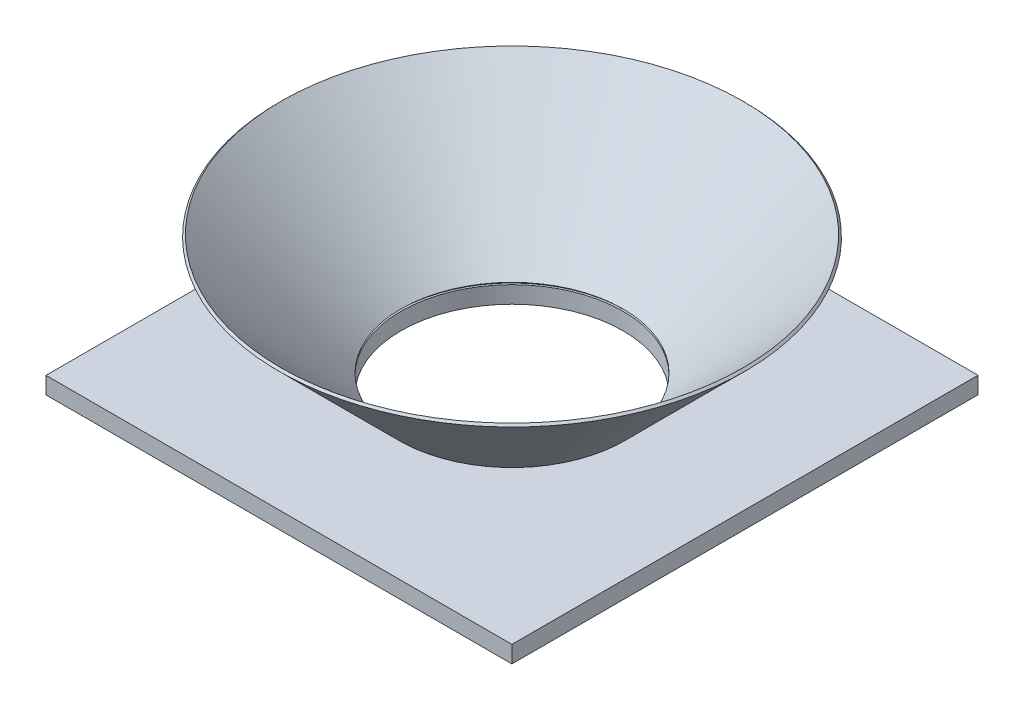
ISO-10303-21;
HEADER;
FILE_DESCRIPTION(('STEP AP214'),'2;1');
FILE_NAME('part.step','',(''),(''),'','','');
FILE_SCHEMA(('AUTOMOTIVE_DESIGN { 1 0 10303 214 1 1 1 1 }'));
ENDSEC;
DATA;
#1=APPLICATION_CONTEXT('core data for automotive mechanical design processes');
#2=APPLICATION_PROTOCOL_DEFINITION('international standard','automotive_design',2000,#1);
#3=PRODUCT_CONTEXT('',#1,'mechanical');
#4=PRODUCT('Part','Part','',(#3));
#5=PRODUCT_RELATED_PRODUCT_CATEGORY('part','',(#4));
#6=PRODUCT_DEFINITION_FORMATION('','',#4);
#7=PRODUCT_DEFINITION_CONTEXT('part definition',#1,'design');
#8=PRODUCT_DEFINITION('design','',#6,#7);
#9=PRODUCT_DEFINITION_SHAPE('','',#8);
#10=(LENGTH_UNIT() NAMED_UNIT(*) SI_UNIT(.MILLI.,.METRE.));
#11=(NAMED_UNIT(*) PLANE_ANGLE_UNIT() SI_UNIT($,.RADIAN.));
#12=(NAMED_UNIT(*) SI_UNIT($,.STERADIAN.) SOLID_ANGLE_UNIT());
#13=UNCERTAINTY_MEASURE_WITH_UNIT(LENGTH_MEASURE(1.E-05),#10,'distance_accuracy_value','');
#14=(GEOMETRIC_REPRESENTATION_CONTEXT(3) GLOBAL_UNCERTAINTY_ASSIGNED_CONTEXT((#13)) GLOBAL_UNIT_ASSIGNED_CONTEXT((#10,
#11,#12)) REPRESENTATION_CONTEXT('',''));
#15=CARTESIAN_POINT('',(0.,0.,0.));
#16=DIRECTION('',(0.,0.,1.));
#17=DIRECTION('',(1.,0.,0.));
#18=AXIS2_PLACEMENT_3D('',#15,#16,#17);
#19=CARTESIAN_POINT('',(-41.2132034355964,-3.,41.2288046063781));
#20=DIRECTION('',(-1.,0.,0.));
#21=DIRECTION('',(0.,0.,1.));
#22=AXIS2_PLACEMENT_3D('',#19,#20,#21);
#23=PLANE('',#22);
#24=DIRECTION('',(0.,0.,1.));
#25=VECTOR('',#24,1.);
#26=CARTESIAN_POINT('',(-41.2132034355964,0.,41.2288046063781));
#27=LINE('',#26,#25);
#28=CARTESIAN_POINT('',(-41.2132034355964,0.,-41.2288046063781));
#29=VERTEX_POINT('',#28);
#30=CARTESIAN_POINT('',(-41.2132034355964,0.,41.2288046063781));
#31=VERTEX_POINT('',#30);
#32=EDGE_CURVE('E106',#29,#31,#27,.T.);
#33=ORIENTED_EDGE('',*,*,#32,.F.);
#34=DIRECTION('',(0.,1.,0.));
#35=VECTOR('',#34,1.);
#36=CARTESIAN_POINT('',(-41.2132034355964,-3.,-41.2288046063781));
#37=LINE('',#36,#35);
#38=CARTESIAN_POINT('',(-41.2132034355964,-3.,-41.2288046063781));
#39=VERTEX_POINT('',#38);
#40=EDGE_CURVE('E12',#39,#29,#37,.T.);
#41=ORIENTED_EDGE('',*,*,#40,.F.);
#42=DIRECTION('',(0.,0.,1.));
#43=VECTOR('',#42,1.);
#44=CARTESIAN_POINT('',(-41.2132034355964,-3.,41.2288046063781));
#45=LINE('',#44,#43);
#46=CARTESIAN_POINT('',(-41.2132034355964,-3.,41.2288046063781));
#47=VERTEX_POINT('',#46);
#48=EDGE_CURVE('E99',#39,#47,#45,.T.);
#49=ORIENTED_EDGE('',*,*,#48,.T.);
#50=DIRECTION('',(0.,1.,0.));
#51=VECTOR('',#50,1.);
#52=CARTESIAN_POINT('',(-41.2132034355964,-3.,41.2288046063781));
#53=LINE('',#52,#51);
#54=EDGE_CURVE('E44',#47,#31,#53,.T.);
#55=ORIENTED_EDGE('',*,*,#54,.T.);
#56=EDGE_LOOP('',(#33,#41,#49,#55));
#57=FACE_BOUND('',#56,.T.);
#58=ADVANCED_FACE('F41',(#57),#23,.T.);
#59=CARTESIAN_POINT('',(-41.2132034355964,-3.,-41.2288046063781));
#60=DIRECTION('',(0.,0.,-1.));
#61=DIRECTION('',(-1.,0.,0.));
#62=AXIS2_PLACEMENT_3D('',#59,#60,#61);
#63=PLANE('',#62);
#64=DIRECTION('',(-1.,0.,0.));
#65=VECTOR('',#64,1.);
#66=CARTESIAN_POINT('',(-41.2132034355964,0.,-41.2288046063781));
#67=LINE('',#66,#65);
#68=CARTESIAN_POINT('',(41.2132034355964,0.,-41.2288046063781));
#69=VERTEX_POINT('',#68);
#70=EDGE_CURVE('E101',#69,#29,#67,.T.);
#71=ORIENTED_EDGE('',*,*,#70,.F.);
#72=DIRECTION('',(0.,1.,0.));
#73=VECTOR('',#72,1.);
#74=CARTESIAN_POINT('',(41.2132034355964,-3.,-41.2288046063781));
#75=LINE('',#74,#73);
#76=CARTESIAN_POINT('',(41.2132034355964,-3.,-41.2288046063781));
#77=VERTEX_POINT('',#76);
#78=EDGE_CURVE('E50',#77,#69,#75,.T.);
#79=ORIENTED_EDGE('',*,*,#78,.F.);
#80=DIRECTION('',(-1.,0.,0.));
#81=VECTOR('',#80,1.);
#82=CARTESIAN_POINT('',(-41.2132034355964,-3.,-41.2288046063781));
#83=LINE('',#82,#81);
#84=EDGE_CURVE('E96',#77,#39,#83,.T.);
#85=ORIENTED_EDGE('',*,*,#84,.T.);
#86=ORIENTED_EDGE('',*,*,#40,.T.);
#87=EDGE_LOOP('',(#71,#79,#85,#86));
#88=FACE_BOUND('',#87,.T.);
#89=ADVANCED_FACE('F117',(#88),#63,.T.);
#90=CARTESIAN_POINT('',(41.2132034355964,-3.,41.2288046063781));
#91=DIRECTION('',(1.,0.,0.));
#92=DIRECTION('',(0.,0.,-1.));
#93=AXIS2_PLACEMENT_3D('',#90,#91,#92);
#94=PLANE('',#93);
#95=DIRECTION('',(0.,0.,-1.));
#96=VECTOR('',#95,1.);
#97=CARTESIAN_POINT('',(41.2132034355964,0.,41.2288046063781));
#98=LINE('',#97,#96);
#99=CARTESIAN_POINT('',(41.2132034355964,0.,41.2288046063781));
#100=VERTEX_POINT('',#99);
#101=EDGE_CURVE('E91',#100,#69,#98,.T.);
#102=ORIENTED_EDGE('',*,*,#101,.F.);
#103=DIRECTION('',(0.,1.,0.));
#104=VECTOR('',#103,1.);
#105=CARTESIAN_POINT('',(41.2132034355964,-3.,41.2288046063781));
#106=LINE('',#105,#104);
#107=CARTESIAN_POINT('',(41.2132034355964,-3.,41.2288046063781));
#108=VERTEX_POINT('',#107);
#109=EDGE_CURVE('E86',#108,#100,#106,.T.);
#110=ORIENTED_EDGE('',*,*,#109,.F.);
#111=DIRECTION('',(0.,0.,-1.));
#112=VECTOR('',#111,1.);
#113=CARTESIAN_POINT('',(41.2132034355964,-3.,41.2288046063781));
#114=LINE('',#113,#112);
#115=EDGE_CURVE('E89',#108,#77,#114,.T.);
#116=ORIENTED_EDGE('',*,*,#115,.T.);
#117=ORIENTED_EDGE('',*,*,#78,.T.);
#118=EDGE_LOOP('',(#102,#110,#116,#117));
#119=FACE_BOUND('',#118,.T.);
#120=ADVANCED_FACE('F88',(#119),#94,.T.);
#121=CARTESIAN_POINT('',(-41.2132034355964,-3.,41.2288046063781));
#122=DIRECTION('',(0.,0.,1.));
#123=DIRECTION('',(1.,0.,0.));
#124=AXIS2_PLACEMENT_3D('',#121,#122,#123);
#125=PLANE('',#124);
#126=DIRECTION('',(1.,0.,0.));
#127=VECTOR('',#126,1.);
#128=CARTESIAN_POINT('',(-41.2132034355964,0.,41.2288046063781));
#129=LINE('',#128,#127);
#130=EDGE_CURVE('E109',#31,#100,#129,.T.);
#131=ORIENTED_EDGE('',*,*,#130,.F.);
#132=ORIENTED_EDGE('',*,*,#54,.F.);
#133=DIRECTION('',(1.,0.,0.));
#134=VECTOR('',#133,1.);
#135=CARTESIAN_POINT('',(-41.2132034355964,-3.,41.2288046063781));
#136=LINE('',#135,#134);
#137=EDGE_CURVE('E95',#47,#108,#136,.T.);
#138=ORIENTED_EDGE('',*,*,#137,.T.);
#139=ORIENTED_EDGE('',*,*,#109,.T.);
#140=EDGE_LOOP('',(#131,#132,#138,#139));
#141=FACE_BOUND('',#140,.T.);
#142=ADVANCED_FACE('F98',(#141),#125,.T.);
#143=CARTESIAN_POINT('',(0.,-3.,0.));
#144=DIRECTION('',(0.,-1.,0.));
#145=DIRECTION('',(0.,0.,-1.));
#146=AXIS2_PLACEMENT_3D('',#143,#144,#145);
#147=PLANE('',#146);
#148=CARTESIAN_POINT('',(0.,-3.,0.));
#149=DIRECTION('',(0.,1.,0.));
#150=DIRECTION('',(0.,0.,1.));
#151=AXIS2_PLACEMENT_3D('',#148,#149,#150);
#152=CIRCLE('',#151,19.6464466094067);
#153=CARTESIAN_POINT('',(0.,-3.,19.6464466094067));
#154=VERTEX_POINT('',#153);
#155=EDGE_CURVE('E110',#154,#154,#152,.T.);
#156=ORIENTED_EDGE('',*,*,#155,.T.);
#157=EDGE_LOOP('',(#156));
#158=FACE_BOUND('',#157,.T.);
#159=ORIENTED_EDGE('',*,*,#48,.F.);
#160=ORIENTED_EDGE('',*,*,#84,.F.);
#161=ORIENTED_EDGE('',*,*,#115,.F.);
#162=ORIENTED_EDGE('',*,*,#137,.F.);
#163=EDGE_LOOP('',(#159,#160,#161,#162));
#164=FACE_BOUND('',#163,.T.);
#165=ADVANCED_FACE('F94',(#158,#164),#147,.T.);
#166=CARTESIAN_POINT('',(0.,0.,0.));
#167=DIRECTION('',(0.,-1.,0.));
#168=DIRECTION('',(0.,0.,-1.));
#169=AXIS2_PLACEMENT_3D('',#166,#167,#168);
#170=PLANE('',#169);
#171=CARTESIAN_POINT('',(0.,0.,0.));
#172=DIRECTION('',(0.,1.,0.));
#173=DIRECTION('',(0.,0.,1.));
#174=AXIS2_PLACEMENT_3D('',#171,#172,#173);
#175=CIRCLE('',#174,19.6464466094067);
#176=CARTESIAN_POINT('',(0.,0.,19.6464466094067));
#177=VERTEX_POINT('',#176);
#178=EDGE_CURVE('E147',#177,#177,#175,.T.);
#179=ORIENTED_EDGE('',*,*,#178,.F.);
#180=EDGE_LOOP('',(#179));
#181=FACE_BOUND('',#180,.T.);
#182=ORIENTED_EDGE('',*,*,#32,.T.);
#183=ORIENTED_EDGE('',*,*,#130,.T.);
#184=ORIENTED_EDGE('',*,*,#101,.T.);
#185=ORIENTED_EDGE('',*,*,#70,.T.);
#186=EDGE_LOOP('',(#182,#183,#184,#185));
#187=FACE_BOUND('',#186,.T.);
#188=ADVANCED_FACE('F116',(#181,#187),#170,.F.);
#189=CARTESIAN_POINT('',(0.,-3.,0.));
#190=DIRECTION('',(0.,1.,0.));
#191=DIRECTION('',(0.,0.,1.));
#192=AXIS2_PLACEMENT_3D('',#189,#190,#191);
#193=CYLINDRICAL_SURFACE('',#192,19.6464466094067);
#194=ORIENTED_EDGE('',*,*,#155,.F.);
#195=EDGE_LOOP('',(#194));
#196=FACE_BOUND('',#195,.T.);
#197=ORIENTED_EDGE('',*,*,#178,.T.);
#198=EDGE_LOOP('',(#197));
#199=FACE_BOUND('',#198,.T.);
#200=ADVANCED_FACE('F135',(#196,#199),#193,.F.);
#201=CLOSED_SHELL('',(#58,#89,#120,#142,#165,#188,#200));
#202=MANIFOLD_SOLID_BREP('B2',#201);
#203=CARTESIAN_POINT('',(0.,0.,0.));
#204=DIRECTION('',(0.,-1.,0.));
#205=DIRECTION('',(0.,0.,-1.));
#206=AXIS2_PLACEMENT_3D('',#203,#204,#205);
#207=CONICAL_SURFACE('',#206,20.,0.785398163397449);
#208=CARTESIAN_POINT('',(0.,0.353553390593273,0.));
#209=DIRECTION('',(0.,-1.,0.));
#210=DIRECTION('',(0.,0.,-1.));
#211=AXIS2_PLACEMENT_3D('',#208,#209,#210);
#212=CIRCLE('',#211,19.6464466094067);
#213=CARTESIAN_POINT('',(0.,0.353553390593273,-19.6464466094067));
#214=VERTEX_POINT('',#213);
#215=EDGE_CURVE('E200',#214,#214,#212,.T.);
#216=ORIENTED_EDGE('',*,*,#215,.F.);
#217=EDGE_LOOP('',(#216));
#218=FACE_BOUND('',#217,.T.);
#219=CARTESIAN_POINT('',(0.,0.,0.));
#220=DIRECTION('',(0.,-1.,0.));
#221=DIRECTION('',(0.,0.,-1.));
#222=AXIS2_PLACEMENT_3D('',#219,#220,#221);
#223=CIRCLE('',#222,20.);
#224=CARTESIAN_POINT('',(0.,0.,-20.));
#225=VERTEX_POINT('',#224);
#226=EDGE_CURVE('E40',#225,#225,#223,.T.);
#227=ORIENTED_EDGE('',*,*,#226,.T.);
#228=EDGE_LOOP('',(#227));
#229=FACE_BOUND('',#228,.T.);
#230=ADVANCED_FACE('F186',(#218,#229),#207,.F.);
#231=CARTESIAN_POINT('',(0.,21.2132034355965,0.));
#232=DIRECTION('',(0.,1.,0.));
#233=DIRECTION('',(0.,0.,1.));
#234=AXIS2_PLACEMENT_3D('',#231,#232,#233);
#235=CONICAL_SURFACE('',#234,41.2132034355964,0.785398163397447);
#236=ORIENTED_EDGE('',*,*,#226,.F.);
#237=EDGE_LOOP('',(#236));
#238=FACE_BOUND('',#237,.T.);
#239=CARTESIAN_POINT('',(0.,21.2132034355965,0.));
#240=DIRECTION('',(0.,-1.,0.));
#241=DIRECTION('',(0.,0.,-1.));
#242=AXIS2_PLACEMENT_3D('',#239,#240,#241);
#243=CIRCLE('',#242,41.2132034355964);
#244=CARTESIAN_POINT('',(0.,21.2132034355965,-41.2132034355964));
#245=VERTEX_POINT('',#244);
#246=EDGE_CURVE('E192',#245,#245,#243,.T.);
#247=ORIENTED_EDGE('',*,*,#246,.T.);
#248=EDGE_LOOP('',(#247));
#249=FACE_BOUND('',#248,.T.);
#250=ADVANCED_FACE('F209',(#238,#249),#235,.T.);
#251=CARTESIAN_POINT('',(0.,21.5667568261897,0.));
#252=DIRECTION('',(0.,-1.,0.));
#253=DIRECTION('',(0.,0.,-1.));
#254=AXIS2_PLACEMENT_3D('',#251,#252,#253);
#255=CONICAL_SURFACE('',#254,40.8596500450031,0.785398163397468);
#256=ORIENTED_EDGE('',*,*,#246,.F.);
#257=EDGE_LOOP('',(#256));
#258=FACE_BOUND('',#257,.T.);
#259=CARTESIAN_POINT('',(0.,21.5667568261897,0.));
#260=DIRECTION('',(0.,-1.,0.));
#261=DIRECTION('',(0.,0.,-1.));
#262=AXIS2_PLACEMENT_3D('',#259,#260,#261);
#263=CIRCLE('',#262,40.8596500450031);
#264=CARTESIAN_POINT('',(0.,21.5667568261897,-40.8596500450031));
#265=VERTEX_POINT('',#264);
#266=EDGE_CURVE('E196',#265,#265,#263,.T.);
#267=ORIENTED_EDGE('',*,*,#266,.T.);
#268=EDGE_LOOP('',(#267));
#269=FACE_BOUND('',#268,.T.);
#270=ADVANCED_FACE('F213',(#258,#269),#255,.T.);
#271=CARTESIAN_POINT('',(0.,0.353553390593273,0.));
#272=DIRECTION('',(0.,1.,0.));
#273=DIRECTION('',(0.,0.,1.));
#274=AXIS2_PLACEMENT_3D('',#271,#272,#273);
#275=CONICAL_SURFACE('',#274,19.6464466094067,0.785398163397447);
#276=ORIENTED_EDGE('',*,*,#266,.F.);
#277=EDGE_LOOP('',(#276));
#278=FACE_BOUND('',#277,.T.);
#279=ORIENTED_EDGE('',*,*,#215,.T.);
#280=EDGE_LOOP('',(#279));
#281=FACE_BOUND('',#280,.T.);
#282=ADVANCED_FACE('F206',(#278,#281),#275,.F.);
#283=CLOSED_SHELL('',(#230,#250,#270,#282));
#284=MANIFOLD_SOLID_BREP('B6',#283);
#285=ADVANCED_BREP_SHAPE_REPRESENTATION('',(#18,#202,#284),#14);
#286=SHAPE_DEFINITION_REPRESENTATION(#9,#285);
ENDSEC;
END-ISO-10303-21;
